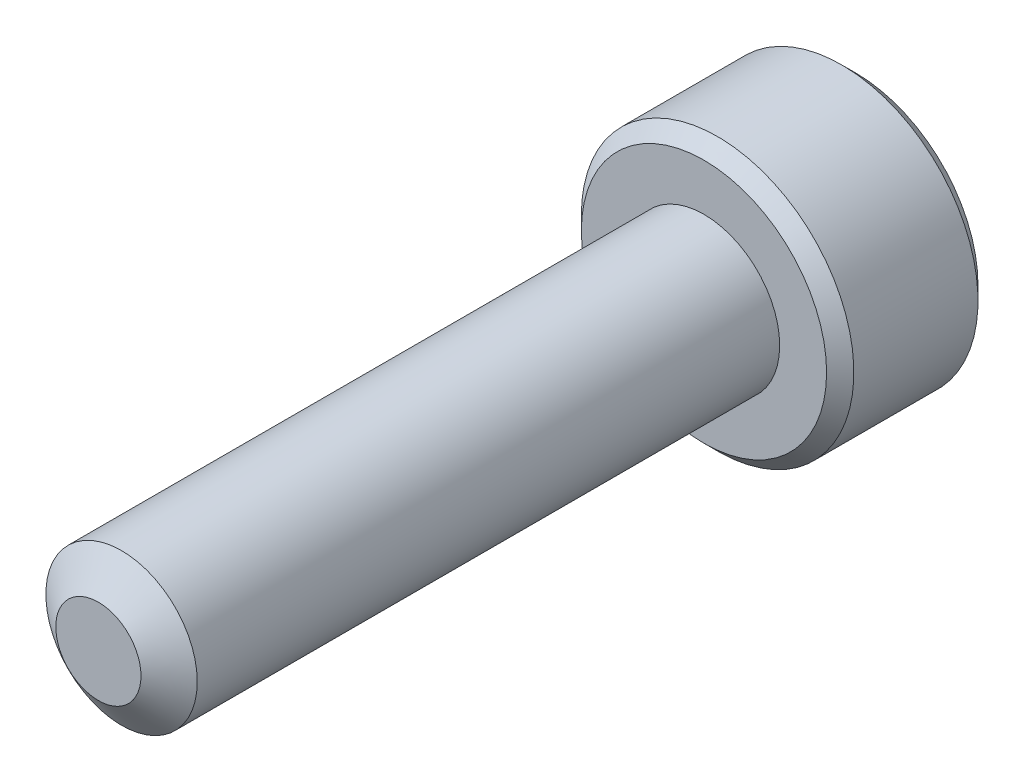
ISO-10303-21;
HEADER;
FILE_DESCRIPTION(('STEP AP214'),'2;1');
FILE_NAME('part.step','',(''),(''),'','','');
FILE_SCHEMA(('AUTOMOTIVE_DESIGN { 1 0 10303 214 1 1 1 1 }'));
ENDSEC;
DATA;
#1=APPLICATION_CONTEXT('core data for automotive mechanical design processes');
#2=APPLICATION_PROTOCOL_DEFINITION('international standard','automotive_design',2000,#1);
#3=PRODUCT_CONTEXT('',#1,'mechanical');
#4=PRODUCT('Part','Part','',(#3));
#5=PRODUCT_RELATED_PRODUCT_CATEGORY('part','',(#4));
#6=PRODUCT_DEFINITION_FORMATION('','',#4);
#7=PRODUCT_DEFINITION_CONTEXT('part definition',#1,'design');
#8=PRODUCT_DEFINITION('design','',#6,#7);
#9=PRODUCT_DEFINITION_SHAPE('','',#8);
#10=(LENGTH_UNIT() NAMED_UNIT(*) SI_UNIT(.MILLI.,.METRE.));
#11=(NAMED_UNIT(*) PLANE_ANGLE_UNIT() SI_UNIT($,.RADIAN.));
#12=(NAMED_UNIT(*) SI_UNIT($,.STERADIAN.) SOLID_ANGLE_UNIT());
#13=UNCERTAINTY_MEASURE_WITH_UNIT(LENGTH_MEASURE(1.E-05),#10,'distance_accuracy_value','');
#14=(GEOMETRIC_REPRESENTATION_CONTEXT(3) GLOBAL_UNCERTAINTY_ASSIGNED_CONTEXT((#13)) GLOBAL_UNIT_ASSIGNED_CONTEXT((#10,
#11,#12)) REPRESENTATION_CONTEXT('',''));
#15=CARTESIAN_POINT('',(0.,0.,0.));
#16=DIRECTION('',(0.,0.,1.));
#17=DIRECTION('',(1.,0.,0.));
#18=AXIS2_PLACEMENT_3D('',#15,#16,#17);
#19=CARTESIAN_POINT('',(0.,0.,-10.));
#20=DIRECTION('',(0.,0.,1.));
#21=DIRECTION('',(1.,0.,0.));
#22=AXIS2_PLACEMENT_3D('',#19,#20,#21);
#23=CYLINDRICAL_SURFACE('',#22,1.25);
#24=CARTESIAN_POINT('',(0.,0.,-10.));
#25=DIRECTION('',(0.,0.,-1.));
#26=DIRECTION('',(-1.,0.,0.));
#27=AXIS2_PLACEMENT_3D('',#24,#25,#26);
#28=CIRCLE('',#27,1.25);
#29=CARTESIAN_POINT('',(-1.25,0.,-10.));
#30=VERTEX_POINT('',#29);
#31=EDGE_CURVE('E215',#30,#30,#28,.F.);
#32=ORIENTED_EDGE('',*,*,#31,.T.);
#33=EDGE_LOOP('',(#32));
#34=FACE_BOUND('',#33,.T.);
#35=CARTESIAN_POINT('',(0.,0.,-0.382511876358968));
#36=DIRECTION('',(0.,0.,1.));
#37=DIRECTION('',(1.,0.,0.));
#38=AXIS2_PLACEMENT_3D('',#35,#36,#37);
#39=CIRCLE('',#38,1.25);
#40=CARTESIAN_POINT('',(1.25,0.,-0.382511876358968));
#41=VERTEX_POINT('',#40);
#42=EDGE_CURVE('E109',#41,#41,#39,.T.);
#43=ORIENTED_EDGE('',*,*,#42,.F.);
#44=EDGE_LOOP('',(#43));
#45=FACE_BOUND('',#44,.T.);
#46=ADVANCED_FACE('F35',(#34,#45),#23,.T.);
#47=CARTESIAN_POINT('',(0.,0.,0.));
#48=DIRECTION('',(0.,0.,-1.));
#49=DIRECTION('',(-1.,0.,0.));
#50=AXIS2_PLACEMENT_3D('',#47,#48,#49);
#51=CONICAL_SURFACE('',#50,0.70371642622275,0.959931088596884);
#52=ORIENTED_EDGE('',*,*,#42,.T.);
#53=EDGE_LOOP('',(#52));
#54=FACE_BOUND('',#53,.T.);
#55=CARTESIAN_POINT('',(0.,0.,0.));
#56=DIRECTION('',(0.,0.,1.));
#57=DIRECTION('',(1.,0.,0.));
#58=AXIS2_PLACEMENT_3D('',#55,#56,#57);
#59=CIRCLE('',#58,0.70371642622275);
#60=CARTESIAN_POINT('',(0.70371642622275,0.,0.));
#61=VERTEX_POINT('',#60);
#62=EDGE_CURVE('E213',#61,#61,#59,.T.);
#63=ORIENTED_EDGE('',*,*,#62,.F.);
#64=EDGE_LOOP('',(#63));
#65=FACE_BOUND('',#64,.T.);
#66=ADVANCED_FACE('F196',(#54,#65),#51,.T.);
#67=CARTESIAN_POINT('',(0.,0.,0.));
#68=DIRECTION('',(0.,0.,1.));
#69=DIRECTION('',(1.,0.,0.));
#70=AXIS2_PLACEMENT_3D('',#67,#68,#69);
#71=PLANE('',#70);
#72=ORIENTED_EDGE('',*,*,#62,.T.);
#73=EDGE_LOOP('',(#72));
#74=FACE_BOUND('',#73,.T.);
#75=ADVANCED_FACE('F193',(#74),#71,.T.);
#76=CARTESIAN_POINT('',(0.,0.,-12.5));
#77=DIRECTION('',(0.,0.,1.));
#78=DIRECTION('',(1.,0.,0.));
#79=AXIS2_PLACEMENT_3D('',#76,#77,#78);
#80=CYLINDRICAL_SURFACE('',#79,2.25);
#81=CARTESIAN_POINT('',(0.,0.,-12.275));
#82=DIRECTION('',(0.,0.,-1.));
#83=DIRECTION('',(-1.,0.,0.));
#84=AXIS2_PLACEMENT_3D('',#81,#82,#83);
#85=CIRCLE('',#84,2.25);
#86=CARTESIAN_POINT('',(-2.25,0.,-12.275));
#87=VERTEX_POINT('',#86);
#88=EDGE_CURVE('E43',#87,#87,#85,.F.);
#89=ORIENTED_EDGE('',*,*,#88,.T.);
#90=EDGE_LOOP('',(#89));
#91=FACE_BOUND('',#90,.T.);
#92=CARTESIAN_POINT('',(0.,0.,-10.225));
#93=DIRECTION('',(0.,0.,-1.));
#94=DIRECTION('',(-1.,0.,0.));
#95=AXIS2_PLACEMENT_3D('',#92,#93,#94);
#96=CIRCLE('',#95,2.25);
#97=CARTESIAN_POINT('',(-2.25,0.,-10.225));
#98=VERTEX_POINT('',#97);
#99=EDGE_CURVE('E172',#98,#98,#96,.T.);
#100=ORIENTED_EDGE('',*,*,#99,.T.);
#101=EDGE_LOOP('',(#100));
#102=FACE_BOUND('',#101,.T.);
#103=ADVANCED_FACE('F177',(#91,#102),#80,.T.);
#104=CARTESIAN_POINT('',(0.,0.,-12.5));
#105=DIRECTION('',(0.,0.,-1.));
#106=DIRECTION('',(-1.,0.,0.));
#107=AXIS2_PLACEMENT_3D('',#104,#105,#106);
#108=PLANE('',#107);
#109=CARTESIAN_POINT('',(0.,0.,-12.5));
#110=DIRECTION('',(0.,0.,-1.));
#111=DIRECTION('',(-1.,0.,0.));
#112=AXIS2_PLACEMENT_3D('',#109,#110,#111);
#113=CIRCLE('',#112,2.025);
#114=CARTESIAN_POINT('',(-2.025,0.,-12.5));
#115=VERTEX_POINT('',#114);
#116=EDGE_CURVE('E108',#115,#115,#113,.T.);
#117=ORIENTED_EDGE('',*,*,#116,.T.);
#118=EDGE_LOOP('',(#117));
#119=FACE_BOUND('',#118,.T.);
#120=CARTESIAN_POINT('',(0.,0.,-12.5));
#121=DIRECTION('',(0.,0.,-1.));
#122=DIRECTION('',(-1.,0.,0.));
#123=AXIS2_PLACEMENT_3D('',#120,#121,#122);
#124=CIRCLE('',#123,1.15470053837925);
#125=CARTESIAN_POINT('',(-1.,0.577350269189626,-12.5));
#126=VERTEX_POINT('',#125);
#127=CARTESIAN_POINT('',(0.,1.15470053837925,-12.5));
#128=VERTEX_POINT('',#127);
#129=EDGE_CURVE('E89',#126,#128,#124,.T.);
#130=ORIENTED_EDGE('',*,*,#129,.F.);
#131=CARTESIAN_POINT('',(-1.,-0.577350269189626,-12.5));
#132=VERTEX_POINT('',#131);
#133=EDGE_CURVE('E49',#132,#126,#124,.T.);
#134=ORIENTED_EDGE('',*,*,#133,.F.);
#135=CARTESIAN_POINT('',(0.,-1.15470053837925,-12.5));
#136=VERTEX_POINT('',#135);
#137=EDGE_CURVE('E274',#136,#132,#124,.T.);
#138=ORIENTED_EDGE('',*,*,#137,.F.);
#139=CARTESIAN_POINT('',(1.,-0.577350269189626,-12.5));
#140=VERTEX_POINT('',#139);
#141=EDGE_CURVE('E56',#140,#136,#124,.T.);
#142=ORIENTED_EDGE('',*,*,#141,.F.);
#143=CARTESIAN_POINT('',(1.,0.577350269189626,-12.5));
#144=VERTEX_POINT('',#143);
#145=EDGE_CURVE('E130',#144,#140,#124,.T.);
#146=ORIENTED_EDGE('',*,*,#145,.F.);
#147=EDGE_CURVE('E98',#128,#144,#124,.T.);
#148=ORIENTED_EDGE('',*,*,#147,.F.);
#149=EDGE_LOOP('',(#130,#134,#138,#142,#146,#148));
#150=FACE_BOUND('',#149,.T.);
#151=ADVANCED_FACE('F129',(#119,#150),#108,.T.);
#152=CARTESIAN_POINT('',(0.,0.,-10.));
#153=DIRECTION('',(0.,0.,-1.));
#154=DIRECTION('',(-1.,0.,0.));
#155=AXIS2_PLACEMENT_3D('',#152,#153,#154);
#156=PLANE('',#155);
#157=CARTESIAN_POINT('',(0.,0.,-10.));
#158=DIRECTION('',(0.,0.,-1.));
#159=DIRECTION('',(-1.,0.,0.));
#160=AXIS2_PLACEMENT_3D('',#157,#158,#159);
#161=CIRCLE('',#160,2.025);
#162=CARTESIAN_POINT('',(-2.025,0.,-10.));
#163=VERTEX_POINT('',#162);
#164=EDGE_CURVE('E11',#163,#163,#161,.F.);
#165=ORIENTED_EDGE('',*,*,#164,.T.);
#166=EDGE_LOOP('',(#165));
#167=FACE_BOUND('',#166,.T.);
#168=ORIENTED_EDGE('',*,*,#31,.F.);
#169=EDGE_LOOP('',(#168));
#170=FACE_BOUND('',#169,.T.);
#171=ADVANCED_FACE('F186',(#167,#170),#156,.F.);
#172=CARTESIAN_POINT('',(0.,0.,-12.5));
#173=DIRECTION('',(0.,0.,-1.));
#174=DIRECTION('',(-1.,0.,0.));
#175=AXIS2_PLACEMENT_3D('',#172,#173,#174);
#176=CONICAL_SURFACE('',#175,1.15470053837925,0.78539816339745);
#177=ORIENTED_EDGE('',*,*,#147,.T.);
#178=CARTESIAN_POINT('',(-0.000200000000000231,1.15481600843309,-12.5001154873726));
#179=CARTESIAN_POINT('',(0.0341825950071802,1.13496520795026,-12.4802779308257));
#180=CARTESIAN_POINT('',(0.0691401181398241,1.11478247255942,-12.4616050206389));
#181=CARTESIAN_POINT('',(0.140422802956089,1.07362739529219,-12.4274147427232));
#182=CARTESIAN_POINT('',(0.176754750528984,1.0526511355808,-12.4119164090235));
#183=CARTESIAN_POINT('',(0.250016613803311,1.01035337909803,-12.3853673071423));
#184=CARTESIAN_POINT('',(0.286927851445414,0.989042666109241,-12.3742497739969));
#185=CARTESIAN_POINT('',(0.361562729310859,0.945952199282691,-12.3571198657762));
#186=CARTESIAN_POINT('',(0.399284088108636,0.924173762626596,-12.3510946974667));
#187=CARTESIAN_POINT('',(0.464292198417934,0.886641312640014,-12.3456605549675));
#188=CARTESIAN_POINT('',(0.491494371528173,0.870936130672275,-12.3448569383167));
#189=CARTESIAN_POINT('',(0.545846040669112,0.839556179862848,-12.3462066994169));
#190=CARTESIAN_POINT('',(0.572995523754876,0.823881418494923,-12.3483607295472));
#191=CARTESIAN_POINT('',(0.654056277326961,0.777080970599366,-12.3591169721285));
#192=CARTESIAN_POINT('',(0.707564140978428,0.74618819111643,-12.3720145564154));
#193=CARTESIAN_POINT('',(0.801476065143432,0.691968116419649,-12.4031407306022));
#194=CARTESIAN_POINT('',(0.842320523671835,0.668386557293371,-12.4197377977018));
#195=CARTESIAN_POINT('',(0.922409637381944,0.622147085933681,-12.4571249246853));
#196=CARTESIAN_POINT('',(0.961659010870438,0.599486449584575,-12.4779013418174));
#197=CARTESIAN_POINT('',(1.0002,0.577234799135788,-12.5001154873726));
#198=B_SPLINE_CURVE_WITH_KNOTS('',3,(#178,#179,#180,#181,#182,#183,#184,#185,#186,#187,#188,
#189,#190,#191,#192,#193,#194,#195,#196,#197),.UNSPECIFIED.,.F.,.F.,(4,2,2,2,2,2,2,2,2,4),(0.,
0.133237676828558,0.26725222983449,0.3991370762693,0.530689603280769,0.624814864263847,
0.718960890149134,0.907306626112099,1.0571010036179,1.20641411519286),.UNSPECIFIED.);
#199=EDGE_CURVE('E103',#128,#144,#198,.T.);
#200=ORIENTED_EDGE('',*,*,#199,.F.);
#201=EDGE_LOOP('',(#177,#200));
#202=FACE_BOUND('',#201,.T.);
#203=ADVANCED_FACE('F104',(#202),#176,.F.);
#204=ORIENTED_EDGE('',*,*,#145,.T.);
#205=CARTESIAN_POINT('',(1.,-1.15147208646462,-12.8703856775139));
#206=CARTESIAN_POINT('',(1.,-1.12343447988552,-12.8492199198737));
#207=CARTESIAN_POINT('',(1.,-1.09524064850697,-12.8282616921759));
#208=CARTESIAN_POINT('',(1.,-1.03847715644376,-12.7868460222356));
#209=CARTESIAN_POINT('',(1.,-1.00990740382975,-12.7663887061237));
#210=CARTESIAN_POINT('',(1.,-0.923120894333477,-12.7056047949545));
#211=CARTESIAN_POINT('',(1.,-0.86425317375906,-12.6661922289614));
#212=CARTESIAN_POINT('',(1.,-0.740809858258045,-12.5888206642002));
#213=CARTESIAN_POINT('',(1.,-0.676100255137807,-12.5510730391143));
#214=CARTESIAN_POINT('',(1.,-0.543448939049124,-12.4820245875513));
#215=CARTESIAN_POINT('',(1.,-0.475519112027778,-12.4507020278469));
#216=CARTESIAN_POINT('',(1.,-0.373555850333528,-12.4123817788838));
#217=CARTESIAN_POINT('',(1.,-0.341031989670907,-12.4013835916422));
#218=CARTESIAN_POINT('',(1.,-0.275199079052293,-12.3819983421474));
#219=CARTESIAN_POINT('',(1.,-0.241889975173933,-12.3736114597767));
#220=CARTESIAN_POINT('',(1.,-0.175247517042993,-12.360025220719));
#221=CARTESIAN_POINT('',(1.,-0.141925568218175,-12.354770790768));
#222=CARTESIAN_POINT('',(1.,-0.0749144362322796,-12.3475486865709));
#223=CARTESIAN_POINT('',(1.,-0.0412251978501624,-12.3455815136105));
#224=CARTESIAN_POINT('',(1.,0.0249580992634204,-12.3450831983932));
#225=CARTESIAN_POINT('',(1.,0.0574512826460387,-12.3464302678886));
#226=CARTESIAN_POINT('',(1.,0.122148505701866,-12.352216484499));
#227=CARTESIAN_POINT('',(1.,0.154352610132926,-12.3566549206615));
#228=CARTESIAN_POINT('',(1.,0.218799898867639,-12.3684568301452));
#229=CARTESIAN_POINT('',(1.,0.251033743268953,-12.3758705410385));
#230=CARTESIAN_POINT('',(1.,0.314797132354918,-12.3932289424987));
#231=CARTESIAN_POINT('',(1.,0.346326735731004,-12.4031734212888));
#232=CARTESIAN_POINT('',(1.,0.445594187730203,-12.4382234825543));
#233=CARTESIAN_POINT('',(1.,0.511919139476035,-12.4673208583567));
#234=CARTESIAN_POINT('',(1.,0.64145324465753,-12.5320153296865));
#235=CARTESIAN_POINT('',(1.,0.704650133126342,-12.5676357767152));
#236=CARTESIAN_POINT('',(1.,0.825428490174983,-12.6411239013469));
#237=CARTESIAN_POINT('',(1.,0.883132947867681,-12.6787919471355));
#238=CARTESIAN_POINT('',(1.,0.968148853704562,-12.7370228529432));
#239=CARTESIAN_POINT('',(1.,0.996120570380282,-12.7566384757629));
#240=CARTESIAN_POINT('',(1.,1.05168177729901,-12.7963885170613));
#241=CARTESIAN_POINT('',(1.,1.079271369977,-12.8165227921988));
#242=CARTESIAN_POINT('',(1.,1.10670185346329,-12.836872119073));
#243=B_SPLINE_CURVE_WITH_KNOTS('',3,(#205,#206,#207,#208,#209,#210,#211,#212,#213,#214,#215,
#216,#217,#218,#219,#220,#221,#222,#223,#224,#225,#226,#227,#228,#229,#230,#231,#232,#233,#234,
#235,#236,#237,#238,#239,#240,#241,#242),.UNSPECIFIED.,.F.,.F.,(4,2,2,2,2,2,2,2,2,2,2,2,2,2,2,2,
2,2,4),(0.,0.10538645908329,0.210799187330123,0.423233611565469,0.647793540908504,
0.87158087773861,0.974493074181421,1.07741235827201,1.17846428203205,1.27953161415762,
1.3769408673961,1.47432772585408,1.57343322804293,1.67253043972851,1.88917353996827,
2.10660791038813,2.31323734249843,2.41572589232044,2.51818641476503),.UNSPECIFIED.);
#244=EDGE_CURVE('E97',#144,#140,#243,.F.);
#245=ORIENTED_EDGE('',*,*,#244,.F.);
#246=EDGE_LOOP('',(#204,#245));
#247=FACE_BOUND('',#246,.T.);
#248=ADVANCED_FACE('F280',(#247),#176,.F.);
#249=ORIENTED_EDGE('',*,*,#141,.T.);
#250=CARTESIAN_POINT('',(1.0002,-0.577234799135788,-12.5001154873726));
#251=CARTESIAN_POINT('',(0.965817404992819,-0.597085599618622,-12.4802779308257));
#252=CARTESIAN_POINT('',(0.930859881860175,-0.617268335009456,-12.4616050206389));
#253=CARTESIAN_POINT('',(0.85957719704391,-0.658423412276686,-12.4274147427232));
#254=CARTESIAN_POINT('',(0.823245249471016,-0.67939967198808,-12.4119164090235));
#255=CARTESIAN_POINT('',(0.749983386196688,-0.721697428470847,-12.3853673071423));
#256=CARTESIAN_POINT('',(0.713072148554585,-0.743008141459637,-12.3742497739969));
#257=CARTESIAN_POINT('',(0.63843727068914,-0.786098608286187,-12.3571198657762));
#258=CARTESIAN_POINT('',(0.600715911891363,-0.807877044942282,-12.3510946974667));
#259=CARTESIAN_POINT('',(0.535707801582066,-0.845409494928864,-12.3456605549675));
#260=CARTESIAN_POINT('',(0.508505628471827,-0.861114676896602,-12.3448569383167));
#261=CARTESIAN_POINT('',(0.454153959330887,-0.89249462770603,-12.3462066994169));
#262=CARTESIAN_POINT('',(0.427004476245123,-0.908169389073955,-12.3483607295472));
#263=CARTESIAN_POINT('',(0.345943722673038,-0.954969836969512,-12.3591169721285));
#264=CARTESIAN_POINT('',(0.292435859021571,-0.985862616452448,-12.3720145564154));
#265=CARTESIAN_POINT('',(0.198523934856567,-1.04008269114923,-12.4031407306022));
#266=CARTESIAN_POINT('',(0.157679476328165,-1.06366425027551,-12.4197377977018));
#267=CARTESIAN_POINT('',(0.0775903626180557,-1.1099037216352,-12.4571249246853));
#268=CARTESIAN_POINT('',(0.0383409891295619,-1.1325643579843,-12.4779013418174));
#269=CARTESIAN_POINT('',(-0.000200000000000337,-1.15481600843309,-12.5001154873726));
#270=B_SPLINE_CURVE_WITH_KNOTS('',3,(#250,#251,#252,#253,#254,#255,#256,#257,#258,#259,#260,
#261,#262,#263,#264,#265,#266,#267,#268,#269),.UNSPECIFIED.,.F.,.F.,(4,2,2,2,2,2,2,2,2,4),(0.,
0.13323767682856,0.267252229834491,0.399137076269301,0.53068960328077,0.624814864263848,
0.718960890149135,0.907306626112099,1.0571010036179,1.20641411519286),.UNSPECIFIED.);
#271=EDGE_CURVE('E140',#140,#136,#270,.T.);
#272=ORIENTED_EDGE('',*,*,#271,.F.);
#273=EDGE_LOOP('',(#249,#272));
#274=FACE_BOUND('',#273,.T.);
#275=ADVANCED_FACE('F277',(#274),#176,.F.);
#276=ORIENTED_EDGE('',*,*,#137,.T.);
#277=CARTESIAN_POINT('',(0.000200000000000252,-1.15481600843309,-12.5001154873726));
#278=CARTESIAN_POINT('',(-0.03418259500718,-1.13496520795026,-12.4802779308257));
#279=CARTESIAN_POINT('',(-0.069140118139824,-1.11478247255942,-12.4616050206389));
#280=CARTESIAN_POINT('',(-0.140422802956089,-1.07362739529219,-12.4274147427232));
#281=CARTESIAN_POINT('',(-0.176754750528984,-1.0526511355808,-12.4119164090235));
#282=CARTESIAN_POINT('',(-0.250016613803311,-1.01035337909803,-12.3853673071423));
#283=CARTESIAN_POINT('',(-0.286927851445414,-0.989042666109241,-12.3742497739969));
#284=CARTESIAN_POINT('',(-0.361562729310859,-0.945952199282691,-12.3571198657762));
#285=CARTESIAN_POINT('',(-0.399284088108636,-0.924173762626596,-12.3510946974667));
#286=CARTESIAN_POINT('',(-0.464292198417934,-0.886641312640014,-12.3456605549675));
#287=CARTESIAN_POINT('',(-0.491494371528173,-0.870936130672275,-12.3448569383167));
#288=CARTESIAN_POINT('',(-0.545846040669113,-0.839556179862848,-12.3462066994169));
#289=CARTESIAN_POINT('',(-0.572995523754876,-0.823881418494923,-12.3483607295472));
#290=CARTESIAN_POINT('',(-0.654056277326961,-0.777080970599366,-12.3591169721285));
#291=CARTESIAN_POINT('',(-0.707564140978428,-0.74618819111643,-12.3720145564154));
#292=CARTESIAN_POINT('',(-0.801476065143432,-0.691968116419649,-12.4031407306022));
#293=CARTESIAN_POINT('',(-0.842320523671835,-0.668386557293371,-12.4197377977018));
#294=CARTESIAN_POINT('',(-0.922409637381944,-0.622147085933681,-12.4571249246853));
#295=CARTESIAN_POINT('',(-0.961659010870438,-0.599486449584575,-12.4779013418174));
#296=CARTESIAN_POINT('',(-1.0002,-0.577234799135788,-12.5001154873726));
#297=B_SPLINE_CURVE_WITH_KNOTS('',3,(#277,#278,#279,#280,#281,#282,#283,#284,#285,#286,#287,
#288,#289,#290,#291,#292,#293,#294,#295,#296),.UNSPECIFIED.,.F.,.F.,(4,2,2,2,2,2,2,2,2,4),(0.,
0.133237676828558,0.26725222983449,0.3991370762693,0.530689603280769,0.624814864263847,
0.718960890149134,0.907306626112099,1.0571010036179,1.20641411519286),.UNSPECIFIED.);
#298=EDGE_CURVE('E251',#136,#132,#297,.T.);
#299=ORIENTED_EDGE('',*,*,#298,.F.);
#300=EDGE_LOOP('',(#276,#299));
#301=FACE_BOUND('',#300,.T.);
#302=ADVANCED_FACE('F276',(#301),#176,.F.);
#303=ORIENTED_EDGE('',*,*,#133,.T.);
#304=CARTESIAN_POINT('',(-1.,-1.15147208663215,-12.8703856776404));
#305=CARTESIAN_POINT('',(-1.,-1.12343448004835,-12.8492199199953));
#306=CARTESIAN_POINT('',(-1.,-1.09524064866509,-12.8282616922927));
#307=CARTESIAN_POINT('',(-1.,-1.0384771565924,-12.7868460223427));
#308=CARTESIAN_POINT('',(-1.,-1.00990740397363,-12.7663887062259));
#309=CARTESIAN_POINT('',(-1.,-0.923120894462777,-12.7056047950421));
#310=CARTESIAN_POINT('',(-1.,-0.864253173878446,-12.6661922290393));
#311=CARTESIAN_POINT('',(-1.,-0.740809858355812,-12.5888206642582));
#312=CARTESIAN_POINT('',(-1.,-0.67610025522381,-12.5510730391622));
#313=CARTESIAN_POINT('',(-1.,-0.543448939110598,-12.4820245875803));
#314=CARTESIAN_POINT('',(-1.,-0.475519112076496,-12.4507020278671));
#315=CARTESIAN_POINT('',(-1.,-0.373555850372649,-12.4123817788976));
#316=CARTESIAN_POINT('',(-1.,-0.341031989714047,-12.4013835916562));
#317=CARTESIAN_POINT('',(-1.,-0.275199079103602,-12.3819983421611));
#318=CARTESIAN_POINT('',(-1.,-0.241889975229392,-12.3736114597899));
#319=CARTESIAN_POINT('',(-1.,-0.175247517106614,-12.3600252207301));
#320=CARTESIAN_POINT('',(-1.,-0.141925568285807,-12.3547707907776));
#321=CARTESIAN_POINT('',(-1.,-0.0749144363078002,-12.3475486865767));
#322=CARTESIAN_POINT('',(-1.,-0.0412251979295619,-12.3455815136139));
#323=CARTESIAN_POINT('',(-1.,0.0249580991768651,-12.3450831983911));
#324=CARTESIAN_POINT('',(-1.,0.0574512825561966,-12.3464302678836));
#325=CARTESIAN_POINT('',(-1.,0.122148505605779,-12.3522164844874));
#326=CARTESIAN_POINT('',(-1.,0.154352610033881,-12.3566549206465));
#327=CARTESIAN_POINT('',(-1.,0.218799898762755,-12.3684568301229));
#328=CARTESIAN_POINT('',(-1.,0.251033743161197,-12.3758705410123));
#329=CARTESIAN_POINT('',(-1.,0.314797132241694,-12.3932289424647));
#330=CARTESIAN_POINT('',(-1.,0.346326735615184,-12.4031734212509));
#331=CARTESIAN_POINT('',(-1.,0.445594187589165,-12.4382234824979));
#332=CARTESIAN_POINT('',(-1.,0.511919139313635,-12.4673208582833));
#333=CARTESIAN_POINT('',(-1.,0.641453244454049,-12.5320153295771));
#334=CARTESIAN_POINT('',(-1.,0.704650132903151,-12.567635776587));
#335=CARTESIAN_POINT('',(-1.,0.825428489916356,-12.6411239011824));
#336=CARTESIAN_POINT('',(-1.,0.883132947593201,-12.6787919469539));
#337=CARTESIAN_POINT('',(-1.,0.968148853406641,-12.737022852736));
#338=CARTESIAN_POINT('',(-1.,0.996120570074659,-12.7566384755472));
#339=CARTESIAN_POINT('',(-1.,1.05168177697804,-12.7963885168287));
#340=CARTESIAN_POINT('',(-1.,1.07927136964838,-12.8165227919578));
#341=CARTESIAN_POINT('',(-1.,1.10670185312703,-12.8368721188235));
#342=B_SPLINE_CURVE_WITH_KNOTS('',3,(#304,#305,#306,#307,#308,#309,#310,#311,#312,#313,#314,
#315,#316,#317,#318,#319,#320,#321,#322,#323,#324,#325,#326,#327,#328,#329,#330,#331,#332,#333,
#334,#335,#336,#337,#338,#339,#340,#341),.UNSPECIFIED.,.F.,.F.,(4,2,2,2,2,2,2,2,2,2,2,2,2,2,2,2,
2,2,4),(0.,0.105386459103349,0.210799187370247,0.423233611646472,0.647793541035351,
0.871580877910865,0.974493074342054,1.07741235842104,1.17846428216995,1.2795316142844,
1.37694086751269,1.47432772596047,1.57343322813835,1.67253043981296,1.88917353997386,
2.10660791031433,2.31323734235672,2.41572589214523,2.51818641455632),.UNSPECIFIED.);
#343=EDGE_CURVE('E119',#132,#126,#342,.T.);
#344=ORIENTED_EDGE('',*,*,#343,.F.);
#345=EDGE_LOOP('',(#303,#344));
#346=FACE_BOUND('',#345,.T.);
#347=ADVANCED_FACE('F289',(#346),#176,.F.);
#348=ORIENTED_EDGE('',*,*,#129,.T.);
#349=CARTESIAN_POINT('',(-1.0002,0.577234799135788,-12.5001154873726));
#350=CARTESIAN_POINT('',(-0.965817404992819,0.597085599618622,-12.4802779308257));
#351=CARTESIAN_POINT('',(-0.930859881860175,0.617268335009456,-12.4616050206389));
#352=CARTESIAN_POINT('',(-0.85957719704391,0.658423412276686,-12.4274147427232));
#353=CARTESIAN_POINT('',(-0.823245249471016,0.67939967198808,-12.4119164090235));
#354=CARTESIAN_POINT('',(-0.749983386196688,0.721697428470847,-12.3853673071423));
#355=CARTESIAN_POINT('',(-0.713072148554585,0.743008141459637,-12.3742497739969));
#356=CARTESIAN_POINT('',(-0.63843727068914,0.786098608286187,-12.3571198657762));
#357=CARTESIAN_POINT('',(-0.600715911891363,0.807877044942282,-12.3510946974667));
#358=CARTESIAN_POINT('',(-0.535707801582065,0.845409494928864,-12.3456605549675));
#359=CARTESIAN_POINT('',(-0.508505628471826,0.861114676896602,-12.3448569383167));
#360=CARTESIAN_POINT('',(-0.454153959330887,0.89249462770603,-12.3462066994169));
#361=CARTESIAN_POINT('',(-0.427004476245123,0.908169389073955,-12.3483607295472));
#362=CARTESIAN_POINT('',(-0.345943722673038,0.954969836969512,-12.3591169721285));
#363=CARTESIAN_POINT('',(-0.292435859021571,0.985862616452448,-12.3720145564154));
#364=CARTESIAN_POINT('',(-0.198523934856567,1.04008269114923,-12.4031407306022));
#365=CARTESIAN_POINT('',(-0.157679476328164,1.06366425027551,-12.4197377977018));
#366=CARTESIAN_POINT('',(-0.0775903626180554,1.1099037216352,-12.4571249246853));
#367=CARTESIAN_POINT('',(-0.0383409891295616,1.1325643579843,-12.4779013418174));
#368=CARTESIAN_POINT('',(0.000200000000000518,1.15481600843309,-12.5001154873726));
#369=B_SPLINE_CURVE_WITH_KNOTS('',3,(#349,#350,#351,#352,#353,#354,#355,#356,#357,#358,#359,
#360,#361,#362,#363,#364,#365,#366,#367,#368),.UNSPECIFIED.,.F.,.F.,(4,2,2,2,2,2,2,2,2,4),(0.,
0.13323767682856,0.267252229834491,0.399137076269301,0.53068960328077,0.624814864263848,
0.718960890149135,0.9073066261121,1.0571010036179,1.20641411519286),.UNSPECIFIED.);
#370=EDGE_CURVE('E93',#126,#128,#369,.T.);
#371=ORIENTED_EDGE('',*,*,#370,.F.);
#372=EDGE_LOOP('',(#348,#371));
#373=FACE_BOUND('',#372,.T.);
#374=ADVANCED_FACE('F91',(#373),#176,.F.);
#375=CARTESIAN_POINT('',(1.,1.73205080756888,-11.));
#376=DIRECTION('',(0.,0.,-1.));
#377=DIRECTION('',(-1.,0.,0.));
#378=AXIS2_PLACEMENT_3D('',#375,#376,#377);
#379=PLANE('',#378);
#380=DIRECTION('',(0.866025403784439,0.5,0.));
#381=VECTOR('',#380,1.);
#382=CARTESIAN_POINT('',(-1.,0.577350269189626,-11.));
#383=LINE('',#382,#381);
#384=CARTESIAN_POINT('',(-1.,0.577350269189626,-11.));
#385=VERTEX_POINT('',#384);
#386=CARTESIAN_POINT('',(0.,1.15470053837925,-11.));
#387=VERTEX_POINT('',#386);
#388=EDGE_CURVE('E118',#385,#387,#383,.T.);
#389=ORIENTED_EDGE('',*,*,#388,.T.);
#390=DIRECTION('',(0.866025403784439,-0.5,0.));
#391=VECTOR('',#390,1.);
#392=CARTESIAN_POINT('',(0.,1.15470053837925,-11.));
#393=LINE('',#392,#391);
#394=CARTESIAN_POINT('',(1.,0.577350269189626,-11.));
#395=VERTEX_POINT('',#394);
#396=EDGE_CURVE('E123',#387,#395,#393,.T.);
#397=ORIENTED_EDGE('',*,*,#396,.T.);
#398=DIRECTION('',(0.,-1.,0.));
#399=VECTOR('',#398,1.);
#400=CARTESIAN_POINT('',(1.,0.577350269189626,-11.));
#401=LINE('',#400,#399);
#402=CARTESIAN_POINT('',(1.,-0.577350269189626,-11.));
#403=VERTEX_POINT('',#402);
#404=EDGE_CURVE('E237',#395,#403,#401,.T.);
#405=ORIENTED_EDGE('',*,*,#404,.T.);
#406=DIRECTION('',(-0.866025403784439,-0.5,0.));
#407=VECTOR('',#406,1.);
#408=CARTESIAN_POINT('',(1.,-0.577350269189626,-11.));
#409=LINE('',#408,#407);
#410=CARTESIAN_POINT('',(0.,-1.15470053837925,-11.));
#411=VERTEX_POINT('',#410);
#412=EDGE_CURVE('E234',#403,#411,#409,.T.);
#413=ORIENTED_EDGE('',*,*,#412,.T.);
#414=DIRECTION('',(-0.866025403784439,0.5,0.));
#415=VECTOR('',#414,1.);
#416=CARTESIAN_POINT('',(0.,-1.15470053837925,-11.));
#417=LINE('',#416,#415);
#418=CARTESIAN_POINT('',(-1.,-0.577350269189626,-11.));
#419=VERTEX_POINT('',#418);
#420=EDGE_CURVE('E231',#411,#419,#417,.T.);
#421=ORIENTED_EDGE('',*,*,#420,.T.);
#422=DIRECTION('',(0.,1.,0.));
#423=VECTOR('',#422,1.);
#424=CARTESIAN_POINT('',(-1.,-0.577350269189626,-11.));
#425=LINE('',#424,#423);
#426=EDGE_CURVE('E126',#419,#385,#425,.T.);
#427=ORIENTED_EDGE('',*,*,#426,.T.);
#428=EDGE_LOOP('',(#389,#397,#405,#413,#421,#427));
#429=FACE_BOUND('',#428,.T.);
#430=ADVANCED_FACE('F160',(#429),#379,.T.);
#431=CARTESIAN_POINT('',(0.,1.15470053837925,-11.));
#432=DIRECTION('',(0.5,0.866025403784439,0.));
#433=DIRECTION('',(-0.866025403784439,0.5,0.));
#434=AXIS2_PLACEMENT_3D('',#431,#432,#433);
#435=PLANE('',#434);
#436=DIRECTION('',(0.,0.,-1.));
#437=VECTOR('',#436,1.);
#438=CARTESIAN_POINT('',(0.,1.15470053837925,-11.));
#439=LINE('',#438,#437);
#440=EDGE_CURVE('E115',#387,#128,#439,.T.);
#441=ORIENTED_EDGE('',*,*,#440,.T.);
#442=ORIENTED_EDGE('',*,*,#199,.T.);
#443=DIRECTION('',(0.,0.,-1.));
#444=VECTOR('',#443,1.);
#445=CARTESIAN_POINT('',(1.,0.577350269189626,-11.));
#446=LINE('',#445,#444);
#447=EDGE_CURVE('E125',#395,#144,#446,.T.);
#448=ORIENTED_EDGE('',*,*,#447,.F.);
#449=ORIENTED_EDGE('',*,*,#396,.F.);
#450=EDGE_LOOP('',(#441,#442,#448,#449));
#451=FACE_BOUND('',#450,.T.);
#452=ADVANCED_FACE('F121',(#451),#435,.F.);
#453=CARTESIAN_POINT('',(1.,0.577350269189626,-11.));
#454=DIRECTION('',(1.,0.,0.));
#455=DIRECTION('',(0.,0.,-1.));
#456=AXIS2_PLACEMENT_3D('',#453,#454,#455);
#457=PLANE('',#456);
#458=ORIENTED_EDGE('',*,*,#447,.T.);
#459=ORIENTED_EDGE('',*,*,#244,.T.);
#460=DIRECTION('',(0.,0.,-1.));
#461=VECTOR('',#460,1.);
#462=CARTESIAN_POINT('',(1.,-0.577350269189626,-11.));
#463=LINE('',#462,#461);
#464=EDGE_CURVE('E220',#403,#140,#463,.T.);
#465=ORIENTED_EDGE('',*,*,#464,.F.);
#466=ORIENTED_EDGE('',*,*,#404,.F.);
#467=EDGE_LOOP('',(#458,#459,#465,#466));
#468=FACE_BOUND('',#467,.T.);
#469=ADVANCED_FACE('F149',(#468),#457,.F.);
#470=CARTESIAN_POINT('',(1.,-0.577350269189626,-11.));
#471=DIRECTION('',(0.5,-0.866025403784439,0.));
#472=DIRECTION('',(0.866025403784439,0.5,0.));
#473=AXIS2_PLACEMENT_3D('',#470,#471,#472);
#474=PLANE('',#473);
#475=ORIENTED_EDGE('',*,*,#464,.T.);
#476=ORIENTED_EDGE('',*,*,#271,.T.);
#477=DIRECTION('',(0.,0.,-1.));
#478=VECTOR('',#477,1.);
#479=CARTESIAN_POINT('',(0.,-1.15470053837925,-11.));
#480=LINE('',#479,#478);
#481=EDGE_CURVE('E223',#411,#136,#480,.T.);
#482=ORIENTED_EDGE('',*,*,#481,.F.);
#483=ORIENTED_EDGE('',*,*,#412,.F.);
#484=EDGE_LOOP('',(#475,#476,#482,#483));
#485=FACE_BOUND('',#484,.T.);
#486=ADVANCED_FACE('F153',(#485),#474,.F.);
#487=CARTESIAN_POINT('',(0.,-1.15470053837925,-11.));
#488=DIRECTION('',(-0.5,-0.866025403784439,0.));
#489=DIRECTION('',(0.866025403784439,-0.5,0.));
#490=AXIS2_PLACEMENT_3D('',#487,#488,#489);
#491=PLANE('',#490);
#492=ORIENTED_EDGE('',*,*,#481,.T.);
#493=ORIENTED_EDGE('',*,*,#298,.T.);
#494=DIRECTION('',(0.,0.,-1.));
#495=VECTOR('',#494,1.);
#496=CARTESIAN_POINT('',(-1.,-0.577350269189626,-11.));
#497=LINE('',#496,#495);
#498=EDGE_CURVE('E226',#419,#132,#497,.T.);
#499=ORIENTED_EDGE('',*,*,#498,.F.);
#500=ORIENTED_EDGE('',*,*,#420,.F.);
#501=EDGE_LOOP('',(#492,#493,#499,#500));
#502=FACE_BOUND('',#501,.T.);
#503=ADVANCED_FACE('F259',(#502),#491,.F.);
#504=CARTESIAN_POINT('',(-1.,-0.577350269189626,-11.));
#505=DIRECTION('',(-1.,0.,0.));
#506=DIRECTION('',(0.,-1.,0.));
#507=AXIS2_PLACEMENT_3D('',#504,#505,#506);
#508=PLANE('',#507);
#509=ORIENTED_EDGE('',*,*,#498,.T.);
#510=ORIENTED_EDGE('',*,*,#343,.T.);
#511=DIRECTION('',(0.,0.,-1.));
#512=VECTOR('',#511,1.);
#513=CARTESIAN_POINT('',(-1.,0.577350269189626,-11.));
#514=LINE('',#513,#512);
#515=EDGE_CURVE('E117',#385,#126,#514,.T.);
#516=ORIENTED_EDGE('',*,*,#515,.F.);
#517=ORIENTED_EDGE('',*,*,#426,.F.);
#518=EDGE_LOOP('',(#509,#510,#516,#517));
#519=FACE_BOUND('',#518,.T.);
#520=ADVANCED_FACE('F256',(#519),#508,.F.);
#521=CARTESIAN_POINT('',(-1.,0.577350269189626,-11.));
#522=DIRECTION('',(-0.5,0.866025403784439,0.));
#523=DIRECTION('',(-0.866025403784439,-0.5,0.));
#524=AXIS2_PLACEMENT_3D('',#521,#522,#523);
#525=PLANE('',#524);
#526=ORIENTED_EDGE('',*,*,#515,.T.);
#527=ORIENTED_EDGE('',*,*,#370,.T.);
#528=ORIENTED_EDGE('',*,*,#440,.F.);
#529=ORIENTED_EDGE('',*,*,#388,.F.);
#530=EDGE_LOOP('',(#526,#527,#528,#529));
#531=FACE_BOUND('',#530,.T.);
#532=ADVANCED_FACE('F113',(#531),#525,.F.);
#533=CARTESIAN_POINT('',(0.,0.,-12.5));
#534=DIRECTION('',(0.,0.,1.));
#535=DIRECTION('',(1.,0.,0.));
#536=AXIS2_PLACEMENT_3D('',#533,#534,#535);
#537=CONICAL_SURFACE('',#536,2.025,0.785398163397447);
#538=ORIENTED_EDGE('',*,*,#88,.F.);
#539=EDGE_LOOP('',(#538));
#540=FACE_BOUND('',#539,.T.);
#541=ORIENTED_EDGE('',*,*,#116,.F.);
#542=EDGE_LOOP('',(#541));
#543=FACE_BOUND('',#542,.T.);
#544=ADVANCED_FACE('F180',(#540,#543),#537,.T.);
#545=CARTESIAN_POINT('',(0.,0.,-10.225));
#546=DIRECTION('',(0.,0.,-1.));
#547=DIRECTION('',(-1.,0.,0.));
#548=AXIS2_PLACEMENT_3D('',#545,#546,#547);
#549=CONICAL_SURFACE('',#548,2.25,0.785398163397447);
#550=ORIENTED_EDGE('',*,*,#164,.F.);
#551=EDGE_LOOP('',(#550));
#552=FACE_BOUND('',#551,.T.);
#553=ORIENTED_EDGE('',*,*,#99,.F.);
#554=EDGE_LOOP('',(#553));
#555=FACE_BOUND('',#554,.T.);
#556=ADVANCED_FACE('F37',(#552,#555),#549,.T.);
#557=CLOSED_SHELL('',(#46,#66,#75,#103,#151,#171,#203,#248,#275,#302,#347,#374,#430,#452,#469,
#486,#503,#520,#532,#544,#556));
#558=MANIFOLD_SOLID_BREP('B2',#557);
#559=ADVANCED_BREP_SHAPE_REPRESENTATION('',(#18,#558),#14);
#560=SHAPE_DEFINITION_REPRESENTATION(#9,#559);
ENDSEC;
END-ISO-10303-21;
